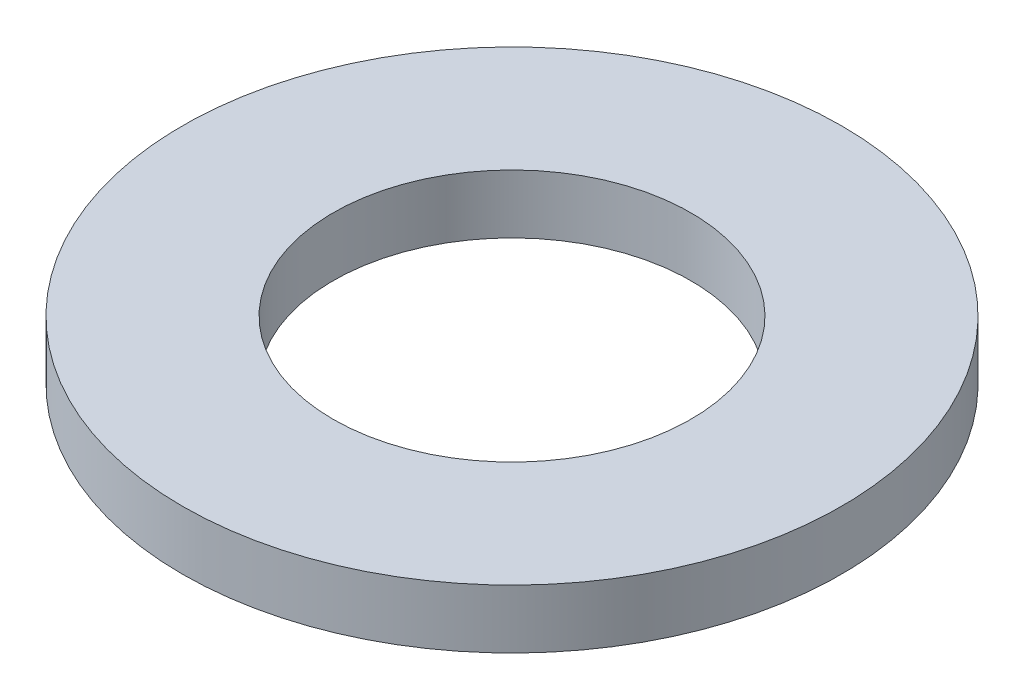
ISO-10303-21;
HEADER;
FILE_DESCRIPTION(('STEP AP214'),'2;1');
FILE_NAME('part.step','',(''),(''),'','','');
FILE_SCHEMA(('AUTOMOTIVE_DESIGN { 1 0 10303 214 1 1 1 1 }'));
ENDSEC;
DATA;
#1=APPLICATION_CONTEXT('core data for automotive mechanical design processes');
#2=APPLICATION_PROTOCOL_DEFINITION('international standard','automotive_design',2000,#1);
#3=PRODUCT_CONTEXT('',#1,'mechanical');
#4=PRODUCT('Part','Part','',(#3));
#5=PRODUCT_RELATED_PRODUCT_CATEGORY('part','',(#4));
#6=PRODUCT_DEFINITION_FORMATION('','',#4);
#7=PRODUCT_DEFINITION_CONTEXT('part definition',#1,'design');
#8=PRODUCT_DEFINITION('design','',#6,#7);
#9=PRODUCT_DEFINITION_SHAPE('','',#8);
#10=(LENGTH_UNIT() NAMED_UNIT(*) SI_UNIT(.MILLI.,.METRE.));
#11=(NAMED_UNIT(*) PLANE_ANGLE_UNIT() SI_UNIT($,.RADIAN.));
#12=(NAMED_UNIT(*) SI_UNIT($,.STERADIAN.) SOLID_ANGLE_UNIT());
#13=UNCERTAINTY_MEASURE_WITH_UNIT(LENGTH_MEASURE(1.E-05),#10,'distance_accuracy_value','');
#14=(GEOMETRIC_REPRESENTATION_CONTEXT(3) GLOBAL_UNCERTAINTY_ASSIGNED_CONTEXT((#13)) GLOBAL_UNIT_ASSIGNED_CONTEXT((#10,
#11,#12)) REPRESENTATION_CONTEXT('',''));
#15=CARTESIAN_POINT('',(0.,0.,0.));
#16=DIRECTION('',(0.,0.,1.));
#17=DIRECTION('',(1.,0.,0.));
#18=AXIS2_PLACEMENT_3D('',#15,#16,#17);
#19=CARTESIAN_POINT('',(0.,3.175,0.));
#20=DIRECTION('',(0.,1.,0.));
#21=DIRECTION('',(0.,0.,1.));
#22=AXIS2_PLACEMENT_3D('',#19,#20,#21);
#23=PLANE('',#22);
#24=CARTESIAN_POINT('',(0.,3.175,0.));
#25=DIRECTION('',(0.,1.,0.));
#26=DIRECTION('',(0.,0.,1.));
#27=AXIS2_PLACEMENT_3D('',#24,#25,#26);
#28=CIRCLE('',#27,17.78);
#29=CARTESIAN_POINT('',(0.,3.175,17.78));
#30=VERTEX_POINT('',#29);
#31=EDGE_CURVE('E10',#30,#30,#28,.T.);
#32=ORIENTED_EDGE('',*,*,#31,.T.);
#33=EDGE_LOOP('',(#32));
#34=FACE_BOUND('',#33,.T.);
#35=CARTESIAN_POINT('',(0.,3.175,0.));
#36=DIRECTION('',(0.,1.,0.));
#37=DIRECTION('',(0.,0.,1.));
#38=AXIS2_PLACEMENT_3D('',#35,#36,#37);
#39=CIRCLE('',#38,9.652);
#40=CARTESIAN_POINT('',(0.,3.175,9.652));
#41=VERTEX_POINT('',#40);
#42=EDGE_CURVE('E46',#41,#41,#39,.T.);
#43=ORIENTED_EDGE('',*,*,#42,.F.);
#44=EDGE_LOOP('',(#43));
#45=FACE_BOUND('',#44,.T.);
#46=ADVANCED_FACE('F35',(#34,#45),#23,.T.);
#47=CARTESIAN_POINT('',(0.,0.,0.));
#48=DIRECTION('',(0.,1.,0.));
#49=DIRECTION('',(0.,0.,1.));
#50=AXIS2_PLACEMENT_3D('',#47,#48,#49);
#51=PLANE('',#50);
#52=CARTESIAN_POINT('',(0.,0.,0.));
#53=DIRECTION('',(0.,1.,0.));
#54=DIRECTION('',(0.,0.,1.));
#55=AXIS2_PLACEMENT_3D('',#52,#53,#54);
#56=CIRCLE('',#55,17.78);
#57=CARTESIAN_POINT('',(0.,0.,17.78));
#58=VERTEX_POINT('',#57);
#59=EDGE_CURVE('E39',#58,#58,#56,.T.);
#60=ORIENTED_EDGE('',*,*,#59,.F.);
#61=EDGE_LOOP('',(#60));
#62=FACE_BOUND('',#61,.T.);
#63=CARTESIAN_POINT('',(0.,0.,0.));
#64=DIRECTION('',(0.,1.,0.));
#65=DIRECTION('',(0.,0.,1.));
#66=AXIS2_PLACEMENT_3D('',#63,#64,#65);
#67=CIRCLE('',#66,9.652);
#68=CARTESIAN_POINT('',(0.,0.,9.652));
#69=VERTEX_POINT('',#68);
#70=EDGE_CURVE('E48',#69,#69,#67,.T.);
#71=ORIENTED_EDGE('',*,*,#70,.T.);
#72=EDGE_LOOP('',(#71));
#73=FACE_BOUND('',#72,.T.);
#74=ADVANCED_FACE('F58',(#62,#73),#51,.F.);
#75=CARTESIAN_POINT('',(0.,3.175,0.));
#76=DIRECTION('',(0.,-1.,0.));
#77=DIRECTION('',(0.,0.,-1.));
#78=AXIS2_PLACEMENT_3D('',#75,#76,#77);
#79=CYLINDRICAL_SURFACE('',#78,17.78);
#80=ORIENTED_EDGE('',*,*,#31,.F.);
#81=EDGE_LOOP('',(#80));
#82=FACE_BOUND('',#81,.T.);
#83=ORIENTED_EDGE('',*,*,#59,.T.);
#84=EDGE_LOOP('',(#83));
#85=FACE_BOUND('',#84,.T.);
#86=ADVANCED_FACE('F37',(#82,#85),#79,.T.);
#87=CARTESIAN_POINT('',(0.,3.175,0.));
#88=DIRECTION('',(0.,-1.,0.));
#89=DIRECTION('',(0.,0.,-1.));
#90=AXIS2_PLACEMENT_3D('',#87,#88,#89);
#91=CYLINDRICAL_SURFACE('',#90,9.652);
#92=ORIENTED_EDGE('',*,*,#42,.T.);
#93=EDGE_LOOP('',(#92));
#94=FACE_BOUND('',#93,.T.);
#95=ORIENTED_EDGE('',*,*,#70,.F.);
#96=EDGE_LOOP('',(#95));
#97=FACE_BOUND('',#96,.T.);
#98=ADVANCED_FACE('F54',(#94,#97),#91,.F.);
#99=CLOSED_SHELL('',(#46,#74,#86,#98));
#100=MANIFOLD_SOLID_BREP('B2',#99);
#101=ADVANCED_BREP_SHAPE_REPRESENTATION('',(#18,#100),#14);
#102=SHAPE_DEFINITION_REPRESENTATION(#9,#101);
ENDSEC;
END-ISO-10303-21;
